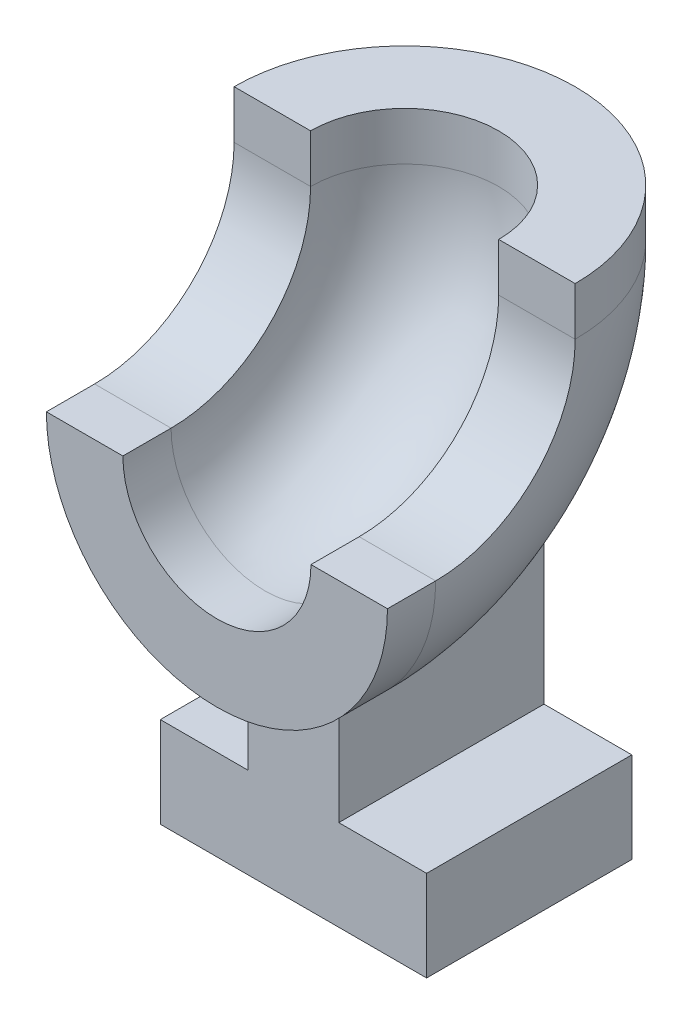
ISO-10303-21;
HEADER;
FILE_DESCRIPTION(('STEP AP214'),'2;1');
FILE_NAME('part.step','',(''),(''),'','','');
FILE_SCHEMA(('AUTOMOTIVE_DESIGN { 1 0 10303 214 1 1 1 1 }'));
ENDSEC;
DATA;
#1=APPLICATION_CONTEXT('core data for automotive mechanical design processes');
#2=APPLICATION_PROTOCOL_DEFINITION('international standard','automotive_design',2000,#1);
#3=PRODUCT_CONTEXT('',#1,'mechanical');
#4=PRODUCT('Part','Part','',(#3));
#5=PRODUCT_RELATED_PRODUCT_CATEGORY('part','',(#4));
#6=PRODUCT_DEFINITION_FORMATION('','',#4);
#7=PRODUCT_DEFINITION_CONTEXT('part definition',#1,'design');
#8=PRODUCT_DEFINITION('design','',#6,#7);
#9=PRODUCT_DEFINITION_SHAPE('','',#8);
#10=(LENGTH_UNIT() NAMED_UNIT(*) SI_UNIT(.MILLI.,.METRE.));
#11=(NAMED_UNIT(*) PLANE_ANGLE_UNIT() SI_UNIT($,.RADIAN.));
#12=(NAMED_UNIT(*) SI_UNIT($,.STERADIAN.) SOLID_ANGLE_UNIT());
#13=UNCERTAINTY_MEASURE_WITH_UNIT(LENGTH_MEASURE(1.E-05),#10,'distance_accuracy_value','');
#14=(GEOMETRIC_REPRESENTATION_CONTEXT(3) GLOBAL_UNCERTAINTY_ASSIGNED_CONTEXT((#13)) GLOBAL_UNIT_ASSIGNED_CONTEXT((#10,
#11,#12)) REPRESENTATION_CONTEXT('',''));
#15=CARTESIAN_POINT('',(0.,0.,0.));
#16=DIRECTION('',(0.,0.,1.));
#17=DIRECTION('',(1.,0.,0.));
#18=AXIS2_PLACEMENT_3D('',#15,#16,#17);
#19=CARTESIAN_POINT('',(11.938,0.,0.));
#20=DIRECTION('',(-1.,0.,0.));
#21=DIRECTION('',(0.,0.,1.));
#22=AXIS2_PLACEMENT_3D('',#19,#20,#21);
#23=PLANE('',#22);
#24=DIRECTION('',(0.,-1.,0.));
#25=VECTOR('',#24,1.);
#26=CARTESIAN_POINT('',(11.938,-33.782,-8.89373853094304));
#27=LINE('',#26,#25);
#28=CARTESIAN_POINT('',(11.938,-25.654,-8.89373853094304));
#29=VERTEX_POINT('',#28);
#30=CARTESIAN_POINT('',(11.938,-33.782,-8.89373853094304));
#31=VERTEX_POINT('',#30);
#32=EDGE_CURVE('E234',#29,#31,#27,.T.);
#33=ORIENTED_EDGE('',*,*,#32,.T.);
#34=DIRECTION('',(0.,0.,-1.));
#35=VECTOR('',#34,1.);
#36=CARTESIAN_POINT('',(11.938,-33.782,-8.89373853094304));
#37=LINE('',#36,#35);
#38=CARTESIAN_POINT('',(11.938,-33.782,-27.2960385309431));
#39=VERTEX_POINT('',#38);
#40=EDGE_CURVE('E331',#31,#39,#37,.T.);
#41=ORIENTED_EDGE('',*,*,#40,.T.);
#42=DIRECTION('',(0.,1.,0.));
#43=VECTOR('',#42,1.);
#44=CARTESIAN_POINT('',(11.938,-33.782,-27.2960385309431));
#45=LINE('',#44,#43);
#46=CARTESIAN_POINT('',(11.938,-25.654,-27.2960385309431));
#47=VERTEX_POINT('',#46);
#48=EDGE_CURVE('E311',#39,#47,#45,.T.);
#49=ORIENTED_EDGE('',*,*,#48,.T.);
#50=DIRECTION('',(0.,0.,1.));
#51=VECTOR('',#50,1.);
#52=CARTESIAN_POINT('',(11.938,-25.654,-8.89373853094304));
#53=LINE('',#52,#51);
#54=EDGE_CURVE('E10',#47,#29,#53,.T.);
#55=ORIENTED_EDGE('',*,*,#54,.T.);
#56=EDGE_LOOP('',(#33,#41,#49,#55));
#57=FACE_BOUND('',#56,.T.);
#58=ADVANCED_FACE('F16',(#57),#23,.F.);
#59=CARTESIAN_POINT('',(11.938,-25.654,-8.89373853094304));
#60=DIRECTION('',(0.,-1.,0.));
#61=DIRECTION('',(0.,0.,-1.));
#62=AXIS2_PLACEMENT_3D('',#59,#60,#61);
#63=PLANE('',#62);
#64=DIRECTION('',(0.,0.,-1.));
#65=VECTOR('',#64,1.);
#66=CARTESIAN_POINT('',(4.064,-25.654,-6.35373853094304));
#67=LINE('',#66,#65);
#68=CARTESIAN_POINT('',(4.064,-25.654,-8.89373853094304));
#69=VERTEX_POINT('',#68);
#70=CARTESIAN_POINT('',(4.064,-25.654,-27.2960385309431));
#71=VERTEX_POINT('',#70);
#72=EDGE_CURVE('E388',#69,#71,#67,.T.);
#73=ORIENTED_EDGE('',*,*,#72,.F.);
#74=DIRECTION('',(-1.,0.,0.));
#75=VECTOR('',#74,1.);
#76=CARTESIAN_POINT('',(11.938,-25.654,-8.89373853094304));
#77=LINE('',#76,#75);
#78=EDGE_CURVE('E230',#29,#69,#77,.T.);
#79=ORIENTED_EDGE('',*,*,#78,.F.);
#80=ORIENTED_EDGE('',*,*,#54,.F.);
#81=DIRECTION('',(-1.,0.,0.));
#82=VECTOR('',#81,1.);
#83=CARTESIAN_POINT('',(11.938,-25.654,-27.2960385309431));
#84=LINE('',#83,#82);
#85=EDGE_CURVE('E314',#47,#71,#84,.T.);
#86=ORIENTED_EDGE('',*,*,#85,.T.);
#87=EDGE_LOOP('',(#73,#79,#80,#86));
#88=FACE_BOUND('',#87,.T.);
#89=ADVANCED_FACE('F367',(#88),#63,.F.);
#90=CARTESIAN_POINT('',(11.938,-25.654,-8.89373853094304));
#91=DIRECTION('',(0.,-1.,0.));
#92=DIRECTION('',(0.,0.,-1.));
#93=AXIS2_PLACEMENT_3D('',#90,#91,#92);
#94=PLANE('',#93);
#95=DIRECTION('',(-1.,0.,0.));
#96=VECTOR('',#95,1.);
#97=CARTESIAN_POINT('',(11.938,-25.654,-8.89373853094304));
#98=LINE('',#97,#96);
#99=CARTESIAN_POINT('',(-4.064,-25.654,-8.89373853094304));
#100=VERTEX_POINT('',#99);
#101=CARTESIAN_POINT('',(-11.938,-25.654,-8.89373853094304));
#102=VERTEX_POINT('',#101);
#103=EDGE_CURVE('E233',#100,#102,#98,.T.);
#104=ORIENTED_EDGE('',*,*,#103,.F.);
#105=DIRECTION('',(0.,0.,-1.));
#106=VECTOR('',#105,1.);
#107=CARTESIAN_POINT('',(-4.064,-25.654,-6.35373853094304));
#108=LINE('',#107,#106);
#109=CARTESIAN_POINT('',(-4.064,-25.654,-27.2960385309431));
#110=VERTEX_POINT('',#109);
#111=EDGE_CURVE('E213',#100,#110,#108,.T.);
#112=ORIENTED_EDGE('',*,*,#111,.T.);
#113=DIRECTION('',(-1.,0.,0.));
#114=VECTOR('',#113,1.);
#115=CARTESIAN_POINT('',(11.938,-25.654,-27.2960385309431));
#116=LINE('',#115,#114);
#117=CARTESIAN_POINT('',(-11.938,-25.654,-27.2960385309431));
#118=VERTEX_POINT('',#117);
#119=EDGE_CURVE('E306',#110,#118,#116,.T.);
#120=ORIENTED_EDGE('',*,*,#119,.T.);
#121=DIRECTION('',(0.,0.,1.));
#122=VECTOR('',#121,1.);
#123=CARTESIAN_POINT('',(-11.938,-25.654,-8.89373853094304));
#124=LINE('',#123,#122);
#125=EDGE_CURVE('E25',#118,#102,#124,.T.);
#126=ORIENTED_EDGE('',*,*,#125,.T.);
#127=EDGE_LOOP('',(#104,#112,#120,#126));
#128=FACE_BOUND('',#127,.T.);
#129=ADVANCED_FACE('F364',(#128),#94,.F.);
#130=CARTESIAN_POINT('',(-11.938,0.,0.));
#131=DIRECTION('',(-1.,0.,0.));
#132=DIRECTION('',(0.,0.,1.));
#133=AXIS2_PLACEMENT_3D('',#130,#131,#132);
#134=PLANE('',#133);
#135=DIRECTION('',(0.,-1.,0.));
#136=VECTOR('',#135,1.);
#137=CARTESIAN_POINT('',(-11.938,-33.782,-8.89373853094304));
#138=LINE('',#137,#136);
#139=CARTESIAN_POINT('',(-11.938,-33.782,-8.89373853094304));
#140=VERTEX_POINT('',#139);
#141=EDGE_CURVE('E324',#102,#140,#138,.T.);
#142=ORIENTED_EDGE('',*,*,#141,.F.);
#143=ORIENTED_EDGE('',*,*,#125,.F.);
#144=DIRECTION('',(0.,1.,0.));
#145=VECTOR('',#144,1.);
#146=CARTESIAN_POINT('',(-11.938,-33.782,-27.2960385309431));
#147=LINE('',#146,#145);
#148=CARTESIAN_POINT('',(-11.938,-33.782,-27.2960385309431));
#149=VERTEX_POINT('',#148);
#150=EDGE_CURVE('E241',#149,#118,#147,.T.);
#151=ORIENTED_EDGE('',*,*,#150,.F.);
#152=DIRECTION('',(0.,0.,-1.));
#153=VECTOR('',#152,1.);
#154=CARTESIAN_POINT('',(-11.938,-33.782,-8.89373853094304));
#155=LINE('',#154,#153);
#156=EDGE_CURVE('E328',#140,#149,#155,.T.);
#157=ORIENTED_EDGE('',*,*,#156,.F.);
#158=EDGE_LOOP('',(#142,#143,#151,#157));
#159=FACE_BOUND('',#158,.T.);
#160=ADVANCED_FACE('F361',(#159),#134,.T.);
#161=CARTESIAN_POINT('',(4.064,-33.782,-8.89373853094304));
#162=DIRECTION('',(0.,1.,0.));
#163=DIRECTION('',(1.,0.,0.));
#164=AXIS2_PLACEMENT_3D('',#161,#162,#163);
#165=PLANE('',#164);
#166=DIRECTION('',(-1.,0.,0.));
#167=VECTOR('',#166,1.);
#168=CARTESIAN_POINT('',(4.064,-33.782,-8.89373853094304));
#169=LINE('',#168,#167);
#170=EDGE_CURVE('E307',#31,#140,#169,.T.);
#171=ORIENTED_EDGE('',*,*,#170,.T.);
#172=ORIENTED_EDGE('',*,*,#156,.T.);
#173=DIRECTION('',(-1.,0.,0.));
#174=VECTOR('',#173,1.);
#175=CARTESIAN_POINT('',(4.064,-33.782,-27.2960385309431));
#176=LINE('',#175,#174);
#177=EDGE_CURVE('E237',#39,#149,#176,.T.);
#178=ORIENTED_EDGE('',*,*,#177,.F.);
#179=ORIENTED_EDGE('',*,*,#40,.F.);
#180=EDGE_LOOP('',(#171,#172,#178,#179));
#181=FACE_BOUND('',#180,.T.);
#182=ADVANCED_FACE('F358',(#181),#165,.F.);
#183=CARTESIAN_POINT('',(4.064,-8.27819658451845,-8.89373853094304));
#184=DIRECTION('',(0.,0.,-1.));
#185=DIRECTION('',(0.,-1.,0.));
#186=AXIS2_PLACEMENT_3D('',#183,#184,#185);
#187=PLANE('',#186);
#188=ORIENTED_EDGE('',*,*,#170,.F.);
#189=ORIENTED_EDGE('',*,*,#32,.F.);
#190=ORIENTED_EDGE('',*,*,#78,.T.);
#191=DIRECTION('',(0.,-1.,0.));
#192=VECTOR('',#191,1.);
#193=CARTESIAN_POINT('',(4.064,-8.27819658451845,-8.89373853094304));
#194=LINE('',#193,#192);
#195=CARTESIAN_POINT('',(4.064,-14.6222088243739,-8.89373853094304));
#196=VERTEX_POINT('',#195);
#197=EDGE_CURVE('E391',#196,#69,#194,.T.);
#198=ORIENTED_EDGE('',*,*,#197,.F.);
#199=CARTESIAN_POINT('',(4.064,-14.6222088243739,-8.89373853094304));
#200=CARTESIAN_POINT('',(2.07130996899468,-15.1739888115514,-8.89373853094304));
#201=CARTESIAN_POINT('',(0.00337201133414951,-15.1745217348797,-8.89373853094304));
#202=CARTESIAN_POINT('',(-2.06745809457848,-15.1750554035366,-8.89373853094304));
#203=CARTESIAN_POINT('',(-4.064,-14.6222088243739,-8.89373853094304));
#204=B_SPLINE_CURVE_WITH_KNOTS('',2,(#199,#200,#201,#202,#203),.UNSPECIFIED.,.F.,.F.,(3,2,3),
(0.,0.5,1.),.UNSPECIFIED.);
#205=CARTESIAN_POINT('',(-4.064,-14.6222088243739,-8.89373853094304));
#206=VERTEX_POINT('',#205);
#207=EDGE_CURVE('E285',#196,#206,#204,.T.);
#208=ORIENTED_EDGE('',*,*,#207,.T.);
#209=DIRECTION('',(0.,-1.,0.));
#210=VECTOR('',#209,1.);
#211=CARTESIAN_POINT('',(-4.064,-8.27819658451845,-8.89373853094304));
#212=LINE('',#211,#210);
#213=EDGE_CURVE('E409',#206,#100,#212,.T.);
#214=ORIENTED_EDGE('',*,*,#213,.T.);
#215=ORIENTED_EDGE('',*,*,#103,.T.);
#216=ORIENTED_EDGE('',*,*,#141,.T.);
#217=EDGE_LOOP('',(#188,#189,#190,#198,#208,#214,#215,#216));
#218=FACE_BOUND('',#217,.T.);
#219=ADVANCED_FACE('F356',(#218),#187,.F.);
#220=CARTESIAN_POINT('',(4.064,12.5095,-27.2960385309431));
#221=DIRECTION('',(0.,0.,1.));
#222=DIRECTION('',(1.,0.,0.));
#223=AXIS2_PLACEMENT_3D('',#220,#221,#222);
#224=PLANE('',#223);
#225=ORIENTED_EDGE('',*,*,#177,.T.);
#226=ORIENTED_EDGE('',*,*,#150,.T.);
#227=ORIENTED_EDGE('',*,*,#119,.F.);
#228=DIRECTION('',(0.,1.,0.));
#229=VECTOR('',#228,1.);
#230=CARTESIAN_POINT('',(-4.064,12.5095,-27.2960385309431));
#231=LINE('',#230,#229);
#232=CARTESIAN_POINT('',(-4.064,-4.92613289475343,-27.2960385309431));
#233=VERTEX_POINT('',#232);
#234=EDGE_CURVE('E200',#110,#233,#231,.T.);
#235=ORIENTED_EDGE('',*,*,#234,.T.);
#236=CARTESIAN_POINT('',(-4.064,-4.92613289475345,-27.2960385309431));
#237=CARTESIAN_POINT('',(-3.09065037004677,-5.34553875640835,-27.2960385309431));
#238=CARTESIAN_POINT('',(-2.06915462114008,-5.5591614245063,-27.2960385309431));
#239=CARTESIAN_POINT('',(-1.04007221308786,-5.7743706702972,-27.2960385309431));
#240=CARTESIAN_POINT('',(0.0066588423128797,-5.77373467510155,-27.2960385309431));
#241=CARTESIAN_POINT('',(1.04884868436616,-5.77310143915325,-27.2960385309431));
#242=CARTESIAN_POINT('',(2.07550506722882,-5.5578316180273,-27.2960385309431));
#243=CARTESIAN_POINT('',(3.09319688138306,-5.34444149212805,-27.2960385309431));
#244=CARTESIAN_POINT('',(4.06400000000009,-4.9261328947534,-27.2960385309431));
#245=B_SPLINE_CURVE_WITH_KNOTS('',2,(#236,#237,#238,#239,#240,#241,#242,#243,#244),
.UNSPECIFIED.,.F.,.F.,(3,2,2,2,3),(0.,0.25,0.5,0.75,1.),.UNSPECIFIED.);
#246=CARTESIAN_POINT('',(4.06400000000009,-4.92613289475339,-27.2960385309431));
#247=VERTEX_POINT('',#246);
#248=EDGE_CURVE('E289',#233,#247,#245,.T.);
#249=ORIENTED_EDGE('',*,*,#248,.T.);
#250=DIRECTION('',(0.,1.,0.));
#251=VECTOR('',#250,1.);
#252=CARTESIAN_POINT('',(4.064,12.5095,-27.2960385309431));
#253=LINE('',#252,#251);
#254=EDGE_CURVE('E385',#71,#247,#253,.T.);
#255=ORIENTED_EDGE('',*,*,#254,.F.);
#256=ORIENTED_EDGE('',*,*,#85,.F.);
#257=ORIENTED_EDGE('',*,*,#48,.F.);
#258=EDGE_LOOP('',(#225,#226,#227,#235,#249,#255,#256,#257));
#259=FACE_BOUND('',#258,.T.);
#260=ADVANCED_FACE('F345',(#259),#224,.F.);
#261=CARTESIAN_POINT('',(0.,0.,-2.032));
#262=DIRECTION('',(0.,0.,1.));
#263=DIRECTION('',(1.,0.,0.));
#264=AXIS2_PLACEMENT_3D('',#261,#262,#263);
#265=PLANE('',#264);
#266=CARTESIAN_POINT('',(0.,0.,-2.032));
#267=DIRECTION('',(0.,0.,1.));
#268=DIRECTION('',(1.,0.,0.));
#269=AXIS2_PLACEMENT_3D('',#266,#267,#268);
#270=CIRCLE('',#269,15.2908);
#271=CARTESIAN_POINT('',(-15.2908,0.,-2.032));
#272=VERTEX_POINT('',#271);
#273=CARTESIAN_POINT('',(15.2908,0.,-2.032));
#274=VERTEX_POINT('',#273);
#275=EDGE_CURVE('E242',#272,#274,#270,.T.);
#276=ORIENTED_EDGE('',*,*,#275,.T.);
#277=DIRECTION('',(-1.,0.,0.));
#278=VECTOR('',#277,1.);
#279=CARTESIAN_POINT('',(8.4328,0.,-2.032));
#280=LINE('',#279,#278);
#281=CARTESIAN_POINT('',(8.4328,0.,-2.032));
#282=VERTEX_POINT('',#281);
#283=EDGE_CURVE('E295',#274,#282,#280,.T.);
#284=ORIENTED_EDGE('',*,*,#283,.T.);
#285=CARTESIAN_POINT('',(0.,0.,-2.032));
#286=DIRECTION('',(0.,0.,-1.));
#287=DIRECTION('',(1.,0.,0.));
#288=AXIS2_PLACEMENT_3D('',#285,#286,#287);
#289=CIRCLE('',#288,8.4328);
#290=CARTESIAN_POINT('',(-8.4328,0.,-2.032));
#291=VERTEX_POINT('',#290);
#292=EDGE_CURVE('E220',#282,#291,#289,.T.);
#293=ORIENTED_EDGE('',*,*,#292,.T.);
#294=DIRECTION('',(-1.,0.,0.));
#295=VECTOR('',#294,1.);
#296=CARTESIAN_POINT('',(-15.2908,0.,-2.032));
#297=LINE('',#296,#295);
#298=EDGE_CURVE('E248',#291,#272,#297,.T.);
#299=ORIENTED_EDGE('',*,*,#298,.T.);
#300=EDGE_LOOP('',(#276,#284,#293,#299));
#301=FACE_BOUND('',#300,.T.);
#302=ADVANCED_FACE('F355',(#301),#265,.T.);
#303=CARTESIAN_POINT('',(0.,16.8312385309532,-18.8632385309431));
#304=DIRECTION('',(0.,-1.,0.));
#305=DIRECTION('',(0.,0.,-1.));
#306=AXIS2_PLACEMENT_3D('',#303,#304,#305);
#307=PLANE('',#306);
#308=CARTESIAN_POINT('',(0.,16.8312385309532,-18.8632385309431));
#309=DIRECTION('',(0.,-1.,0.));
#310=DIRECTION('',(1.,0.,0.));
#311=AXIS2_PLACEMENT_3D('',#308,#309,#310);
#312=CIRCLE('',#311,15.2908);
#313=CARTESIAN_POINT('',(-15.2908,16.8312385309532,-18.8632385309431));
#314=VERTEX_POINT('',#313);
#315=CARTESIAN_POINT('',(15.2908,16.8312385309532,-18.8632385309431));
#316=VERTEX_POINT('',#315);
#317=EDGE_CURVE('E196',#314,#316,#312,.T.);
#318=ORIENTED_EDGE('',*,*,#317,.F.);
#319=DIRECTION('',(-1.,0.,0.));
#320=VECTOR('',#319,1.);
#321=CARTESIAN_POINT('',(-15.2908,16.8312385309532,-18.8632385309431));
#322=LINE('',#321,#320);
#323=CARTESIAN_POINT('',(-8.4328,16.8312385309532,-18.8632385309431));
#324=VERTEX_POINT('',#323);
#325=EDGE_CURVE('E189',#324,#314,#322,.T.);
#326=ORIENTED_EDGE('',*,*,#325,.F.);
#327=CARTESIAN_POINT('',(0.,16.8312385309532,-18.8632385309431));
#328=DIRECTION('',(0.,1.,0.));
#329=DIRECTION('',(1.,0.,0.));
#330=AXIS2_PLACEMENT_3D('',#327,#328,#329);
#331=CIRCLE('',#330,8.4328);
#332=CARTESIAN_POINT('',(8.4328,16.8312385309532,-18.8632385309431));
#333=VERTEX_POINT('',#332);
#334=EDGE_CURVE('E171',#333,#324,#331,.T.);
#335=ORIENTED_EDGE('',*,*,#334,.F.);
#336=DIRECTION('',(-1.,0.,0.));
#337=VECTOR('',#336,1.);
#338=CARTESIAN_POINT('',(8.4328,16.8312385309532,-18.8632385309431));
#339=LINE('',#338,#337);
#340=EDGE_CURVE('E228',#316,#333,#339,.T.);
#341=ORIENTED_EDGE('',*,*,#340,.F.);
#342=EDGE_LOOP('',(#318,#326,#335,#341));
#343=FACE_BOUND('',#342,.T.);
#344=ADVANCED_FACE('F195',(#343),#307,.F.);
#345=CARTESIAN_POINT('',(0.,0.,-2.032));
#346=DIRECTION('',(0.,0.,-1.));
#347=DIRECTION('',(-1.,0.,0.));
#348=AXIS2_PLACEMENT_3D('',#345,#346,#347);
#349=CYLINDRICAL_SURFACE('',#348,15.2908);
#350=DIRECTION('',(0.,0.,-1.));
#351=VECTOR('',#350,1.);
#352=CARTESIAN_POINT('',(15.2908,0.,-2.032));
#353=LINE('',#352,#351);
#354=CARTESIAN_POINT('',(15.2908,0.,-6.35373853094303));
#355=VERTEX_POINT('',#354);
#356=EDGE_CURVE('E298',#274,#355,#353,.T.);
#357=ORIENTED_EDGE('',*,*,#356,.F.);
#358=ORIENTED_EDGE('',*,*,#275,.F.);
#359=DIRECTION('',(0.,0.,-1.));
#360=VECTOR('',#359,1.);
#361=CARTESIAN_POINT('',(-15.2908,0.,-2.032));
#362=LINE('',#361,#360);
#363=CARTESIAN_POINT('',(-15.2908,0.,-6.35373853094303));
#364=VERTEX_POINT('',#363);
#365=EDGE_CURVE('E286',#272,#364,#362,.T.);
#366=ORIENTED_EDGE('',*,*,#365,.T.);
#367=CARTESIAN_POINT('',(0.,0.,-6.35373853094303));
#368=DIRECTION('',(0.,0.,1.));
#369=DIRECTION('',(1.,0.,0.));
#370=AXIS2_PLACEMENT_3D('',#367,#368,#369);
#371=CIRCLE('',#370,15.2908);
#372=EDGE_CURVE('E281',#364,#355,#371,.T.);
#373=ORIENTED_EDGE('',*,*,#372,.T.);
#374=EDGE_LOOP('',(#357,#358,#366,#373));
#375=FACE_BOUND('',#374,.T.);
#376=ADVANCED_FACE('F454',(#375),#349,.T.);
#377=CARTESIAN_POINT('',(8.4328,0.,-2.032));
#378=DIRECTION('',(0.,-1.,0.));
#379=DIRECTION('',(0.,0.,-1.));
#380=AXIS2_PLACEMENT_3D('',#377,#378,#379);
#381=PLANE('',#380);
#382=DIRECTION('',(0.,0.,-1.));
#383=VECTOR('',#382,1.);
#384=CARTESIAN_POINT('',(8.4328,0.,-2.032));
#385=LINE('',#384,#383);
#386=CARTESIAN_POINT('',(8.4328,0.,-6.35373853094303));
#387=VERTEX_POINT('',#386);
#388=EDGE_CURVE('E222',#282,#387,#385,.T.);
#389=ORIENTED_EDGE('',*,*,#388,.F.);
#390=ORIENTED_EDGE('',*,*,#283,.F.);
#391=ORIENTED_EDGE('',*,*,#356,.T.);
#392=DIRECTION('',(-1.,0.,0.));
#393=VECTOR('',#392,1.);
#394=CARTESIAN_POINT('',(8.4328,0.,-6.35373853094303));
#395=LINE('',#394,#393);
#396=EDGE_CURVE('E274',#355,#387,#395,.T.);
#397=ORIENTED_EDGE('',*,*,#396,.T.);
#398=EDGE_LOOP('',(#389,#390,#391,#397));
#399=FACE_BOUND('',#398,.T.);
#400=ADVANCED_FACE('F452',(#399),#381,.F.);
#401=CARTESIAN_POINT('',(0.,0.,-2.032));
#402=DIRECTION('',(0.,0.,-1.));
#403=DIRECTION('',(-1.,0.,0.));
#404=AXIS2_PLACEMENT_3D('',#401,#402,#403);
#405=CYLINDRICAL_SURFACE('',#404,8.4328);
#406=DIRECTION('',(0.,0.,-1.));
#407=VECTOR('',#406,1.);
#408=CARTESIAN_POINT('',(-8.4328,0.,-2.032));
#409=LINE('',#408,#407);
#410=CARTESIAN_POINT('',(-8.4328,0.,-6.35373853094303));
#411=VERTEX_POINT('',#410);
#412=EDGE_CURVE('E223',#291,#411,#409,.T.);
#413=ORIENTED_EDGE('',*,*,#412,.F.);
#414=ORIENTED_EDGE('',*,*,#292,.F.);
#415=ORIENTED_EDGE('',*,*,#388,.T.);
#416=CARTESIAN_POINT('',(0.,0.,-6.35373853094303));
#417=DIRECTION('',(0.,0.,-1.));
#418=DIRECTION('',(1.,0.,0.));
#419=AXIS2_PLACEMENT_3D('',#416,#417,#418);
#420=CIRCLE('',#419,8.4328);
#421=EDGE_CURVE('E267',#387,#411,#420,.T.);
#422=ORIENTED_EDGE('',*,*,#421,.T.);
#423=EDGE_LOOP('',(#413,#414,#415,#422));
#424=FACE_BOUND('',#423,.T.);
#425=ADVANCED_FACE('F449',(#424),#405,.F.);
#426=CARTESIAN_POINT('',(-15.2908,0.,-2.032));
#427=DIRECTION('',(0.,-1.,0.));
#428=DIRECTION('',(0.,0.,-1.));
#429=AXIS2_PLACEMENT_3D('',#426,#427,#428);
#430=PLANE('',#429);
#431=DIRECTION('',(-1.,0.,0.));
#432=VECTOR('',#431,1.);
#433=CARTESIAN_POINT('',(-15.2908,0.,-6.35373853094303));
#434=LINE('',#433,#432);
#435=EDGE_CURVE('E259',#411,#364,#434,.T.);
#436=ORIENTED_EDGE('',*,*,#435,.T.);
#437=ORIENTED_EDGE('',*,*,#365,.F.);
#438=ORIENTED_EDGE('',*,*,#298,.F.);
#439=ORIENTED_EDGE('',*,*,#412,.T.);
#440=EDGE_LOOP('',(#436,#437,#438,#439));
#441=FACE_BOUND('',#440,.T.);
#442=ADVANCED_FACE('F460',(#441),#430,.F.);
#443=CARTESIAN_POINT('',(0.,12.5095,-6.35373853094304));
#444=DIRECTION('',(1.,0.,0.));
#445=DIRECTION('',(0.,0.,-1.));
#446=AXIS2_PLACEMENT_3D('',#443,#444,#445);
#447=DEGENERATE_TOROIDAL_SURFACE('',#446,12.5095,15.2908,.T.);
#448=ORIENTED_EDGE('',*,*,#207,.F.);
#449=CARTESIAN_POINT('',(4.064,12.5095,-6.35373853094304));
#450=DIRECTION('',(1.,0.,0.));
#451=DIRECTION('',(0.,0.,-1.));
#452=AXIS2_PLACEMENT_3D('',#449,#450,#451);
#453=CIRCLE('',#452,27.2503435525244);
#454=EDGE_CURVE('E420',#196,#247,#453,.T.);
#455=ORIENTED_EDGE('',*,*,#454,.T.);
#456=ORIENTED_EDGE('',*,*,#248,.F.);
#457=CARTESIAN_POINT('',(-4.064,12.5095,-6.35373853094304));
#458=DIRECTION('',(1.,0.,0.));
#459=DIRECTION('',(0.,0.,-1.));
#460=AXIS2_PLACEMENT_3D('',#457,#458,#459);
#461=CIRCLE('',#460,27.2503435525244);
#462=EDGE_CURVE('E209',#206,#233,#461,.T.);
#463=ORIENTED_EDGE('',*,*,#462,.F.);
#464=EDGE_LOOP('',(#448,#455,#456,#463));
#465=FACE_BOUND('',#464,.T.);
#466=CARTESIAN_POINT('',(15.2908,12.5095,-6.35373853094304));
#467=DIRECTION('',(1.,0.,0.));
#468=DIRECTION('',(0.,-1.,0.));
#469=AXIS2_PLACEMENT_3D('',#466,#467,#468);
#470=CIRCLE('',#469,12.5095);
#471=CARTESIAN_POINT('',(15.2908,12.5095,-18.8632385309431));
#472=VERTEX_POINT('',#471);
#473=EDGE_CURVE('E278',#355,#472,#470,.T.);
#474=ORIENTED_EDGE('',*,*,#473,.F.);
#475=ORIENTED_EDGE('',*,*,#372,.F.);
#476=CARTESIAN_POINT('',(-15.2908,12.5095,-6.35373853094304));
#477=DIRECTION('',(1.,0.,0.));
#478=DIRECTION('',(0.,-1.,0.));
#479=AXIS2_PLACEMENT_3D('',#476,#477,#478);
#480=CIRCLE('',#479,12.5095);
#481=CARTESIAN_POINT('',(-15.2908,12.5095,-18.8632385309431));
#482=VERTEX_POINT('',#481);
#483=EDGE_CURVE('E257',#364,#482,#480,.T.);
#484=ORIENTED_EDGE('',*,*,#483,.T.);
#485=CARTESIAN_POINT('',(0.,12.5095,-18.8632385309431));
#486=DIRECTION('',(0.,-1.,0.));
#487=DIRECTION('',(1.,0.,0.));
#488=AXIS2_PLACEMENT_3D('',#485,#486,#487);
#489=CIRCLE('',#488,15.2908);
#490=EDGE_CURVE('E251',#482,#472,#489,.T.);
#491=ORIENTED_EDGE('',*,*,#490,.T.);
#492=EDGE_LOOP('',(#474,#475,#484,#491));
#493=FACE_BOUND('',#492,.T.);
#494=ADVANCED_FACE('F476',(#465,#493),#447,.T.);
#495=CARTESIAN_POINT('',(0.,12.5095,-6.35373853094304));
#496=DIRECTION('',(1.,0.,0.));
#497=DIRECTION('',(0.,0.,-1.));
#498=AXIS2_PLACEMENT_3D('',#495,#496,#497);
#499=CYLINDRICAL_SURFACE('',#498,12.5095);
#500=CARTESIAN_POINT('',(8.4328,12.5095,-6.35373853094304));
#501=DIRECTION('',(1.,0.,0.));
#502=DIRECTION('',(0.,-1.,0.));
#503=AXIS2_PLACEMENT_3D('',#500,#501,#502);
#504=CIRCLE('',#503,12.5095);
#505=CARTESIAN_POINT('',(8.4328,12.5095,-18.8632385309431));
#506=VERTEX_POINT('',#505);
#507=EDGE_CURVE('E271',#387,#506,#504,.T.);
#508=ORIENTED_EDGE('',*,*,#507,.F.);
#509=ORIENTED_EDGE('',*,*,#396,.F.);
#510=ORIENTED_EDGE('',*,*,#473,.T.);
#511=DIRECTION('',(-1.,0.,0.));
#512=VECTOR('',#511,1.);
#513=CARTESIAN_POINT('',(8.4328,12.5095,-18.8632385309431));
#514=LINE('',#513,#512);
#515=EDGE_CURVE('E183',#472,#506,#514,.T.);
#516=ORIENTED_EDGE('',*,*,#515,.T.);
#517=EDGE_LOOP('',(#508,#509,#510,#516));
#518=FACE_BOUND('',#517,.T.);
#519=ADVANCED_FACE('F480',(#518),#499,.F.);
#520=CARTESIAN_POINT('',(0.,12.5095,-6.35373853094304));
#521=DIRECTION('',(1.,0.,0.));
#522=DIRECTION('',(0.,0.,-1.));
#523=AXIS2_PLACEMENT_3D('',#520,#521,#522);
#524=TOROIDAL_SURFACE('',#523,12.5095,8.4328);
#525=CARTESIAN_POINT('',(0.,12.5095,-18.8632385309431));
#526=DIRECTION('',(0.,1.,0.));
#527=DIRECTION('',(1.,0.,0.));
#528=AXIS2_PLACEMENT_3D('',#525,#526,#527);
#529=CIRCLE('',#528,8.4328);
#530=CARTESIAN_POINT('',(-8.4328,12.5095,-18.8632385309431));
#531=VERTEX_POINT('',#530);
#532=EDGE_CURVE('E193',#506,#531,#529,.T.);
#533=ORIENTED_EDGE('',*,*,#532,.T.);
#534=CARTESIAN_POINT('',(-8.4328,12.5095,-6.35373853094304));
#535=DIRECTION('',(1.,0.,0.));
#536=DIRECTION('',(0.,-1.,0.));
#537=AXIS2_PLACEMENT_3D('',#534,#535,#536);
#538=CIRCLE('',#537,12.5095);
#539=EDGE_CURVE('E264',#411,#531,#538,.T.);
#540=ORIENTED_EDGE('',*,*,#539,.F.);
#541=ORIENTED_EDGE('',*,*,#421,.F.);
#542=ORIENTED_EDGE('',*,*,#507,.T.);
#543=EDGE_LOOP('',(#533,#540,#541,#542));
#544=FACE_BOUND('',#543,.T.);
#545=ADVANCED_FACE('F485',(#544),#524,.F.);
#546=CARTESIAN_POINT('',(0.,12.5095,-6.35373853094304));
#547=DIRECTION('',(1.,0.,0.));
#548=DIRECTION('',(0.,0.,-1.));
#549=AXIS2_PLACEMENT_3D('',#546,#547,#548);
#550=CYLINDRICAL_SURFACE('',#549,12.5095);
#551=DIRECTION('',(-1.,0.,0.));
#552=VECTOR('',#551,1.);
#553=CARTESIAN_POINT('',(-15.2908,12.5095,-18.8632385309431));
#554=LINE('',#553,#552);
#555=EDGE_CURVE('E191',#531,#482,#554,.T.);
#556=ORIENTED_EDGE('',*,*,#555,.T.);
#557=ORIENTED_EDGE('',*,*,#483,.F.);
#558=ORIENTED_EDGE('',*,*,#435,.F.);
#559=ORIENTED_EDGE('',*,*,#539,.T.);
#560=EDGE_LOOP('',(#556,#557,#558,#559));
#561=FACE_BOUND('',#560,.T.);
#562=ADVANCED_FACE('F489',(#561),#550,.F.);
#563=CARTESIAN_POINT('',(0.,12.5095,-18.8632385309431));
#564=DIRECTION('',(0.,1.,0.));
#565=DIRECTION('',(0.,0.,1.));
#566=AXIS2_PLACEMENT_3D('',#563,#564,#565);
#567=CYLINDRICAL_SURFACE('',#566,15.2908);
#568=DIRECTION('',(0.,1.,0.));
#569=VECTOR('',#568,1.);
#570=CARTESIAN_POINT('',(15.2908,12.5095,-18.8632385309431));
#571=LINE('',#570,#569);
#572=EDGE_CURVE('E225',#472,#316,#571,.T.);
#573=ORIENTED_EDGE('',*,*,#572,.F.);
#574=ORIENTED_EDGE('',*,*,#490,.F.);
#575=DIRECTION('',(0.,1.,0.));
#576=VECTOR('',#575,1.);
#577=CARTESIAN_POINT('',(-15.2908,12.5095,-18.8632385309431));
#578=LINE('',#577,#576);
#579=EDGE_CURVE('E199',#482,#314,#578,.T.);
#580=ORIENTED_EDGE('',*,*,#579,.T.);
#581=ORIENTED_EDGE('',*,*,#317,.T.);
#582=EDGE_LOOP('',(#573,#574,#580,#581));
#583=FACE_BOUND('',#582,.T.);
#584=ADVANCED_FACE('F512',(#583),#567,.T.);
#585=CARTESIAN_POINT('',(8.4328,12.5095,-18.8632385309431));
#586=DIRECTION('',(0.,0.,-1.));
#587=DIRECTION('',(0.,-1.,0.));
#588=AXIS2_PLACEMENT_3D('',#585,#586,#587);
#589=PLANE('',#588);
#590=DIRECTION('',(0.,1.,0.));
#591=VECTOR('',#590,1.);
#592=CARTESIAN_POINT('',(8.4328,12.5095,-18.8632385309431));
#593=LINE('',#592,#591);
#594=EDGE_CURVE('E178',#506,#333,#593,.T.);
#595=ORIENTED_EDGE('',*,*,#594,.F.);
#596=ORIENTED_EDGE('',*,*,#515,.F.);
#597=ORIENTED_EDGE('',*,*,#572,.T.);
#598=ORIENTED_EDGE('',*,*,#340,.T.);
#599=EDGE_LOOP('',(#595,#596,#597,#598));
#600=FACE_BOUND('',#599,.T.);
#601=ADVANCED_FACE('F515',(#600),#589,.F.);
#602=CARTESIAN_POINT('',(0.,12.5095,-18.8632385309431));
#603=DIRECTION('',(0.,1.,0.));
#604=DIRECTION('',(0.,0.,1.));
#605=AXIS2_PLACEMENT_3D('',#602,#603,#604);
#606=CYLINDRICAL_SURFACE('',#605,8.4328);
#607=DIRECTION('',(0.,1.,0.));
#608=VECTOR('',#607,1.);
#609=CARTESIAN_POINT('',(-8.4328,12.5095,-18.8632385309431));
#610=LINE('',#609,#608);
#611=EDGE_CURVE('E175',#531,#324,#610,.T.);
#612=ORIENTED_EDGE('',*,*,#611,.F.);
#613=ORIENTED_EDGE('',*,*,#532,.F.);
#614=ORIENTED_EDGE('',*,*,#594,.T.);
#615=ORIENTED_EDGE('',*,*,#334,.T.);
#616=EDGE_LOOP('',(#612,#613,#614,#615));
#617=FACE_BOUND('',#616,.T.);
#618=ADVANCED_FACE('F173',(#617),#606,.F.);
#619=CARTESIAN_POINT('',(-15.2908,12.5095,-18.8632385309431));
#620=DIRECTION('',(0.,0.,-1.));
#621=DIRECTION('',(0.,-1.,0.));
#622=AXIS2_PLACEMENT_3D('',#619,#620,#621);
#623=PLANE('',#622);
#624=ORIENTED_EDGE('',*,*,#325,.T.);
#625=ORIENTED_EDGE('',*,*,#579,.F.);
#626=ORIENTED_EDGE('',*,*,#555,.F.);
#627=ORIENTED_EDGE('',*,*,#611,.T.);
#628=EDGE_LOOP('',(#624,#625,#626,#627));
#629=FACE_BOUND('',#628,.T.);
#630=ADVANCED_FACE('F187',(#629),#623,.F.);
#631=CARTESIAN_POINT('',(-4.064,12.5095,-6.35373853094304));
#632=DIRECTION('',(1.,0.,0.));
#633=DIRECTION('',(0.,1.,0.));
#634=AXIS2_PLACEMENT_3D('',#631,#632,#633);
#635=PLANE('',#634);
#636=ORIENTED_EDGE('',*,*,#111,.F.);
#637=ORIENTED_EDGE('',*,*,#213,.F.);
#638=ORIENTED_EDGE('',*,*,#462,.T.);
#639=ORIENTED_EDGE('',*,*,#234,.F.);
#640=EDGE_LOOP('',(#636,#637,#638,#639));
#641=FACE_BOUND('',#640,.T.);
#642=ADVANCED_FACE('F520',(#641),#635,.F.);
#643=CARTESIAN_POINT('',(4.064,12.5095,-6.35373853094304));
#644=DIRECTION('',(1.,0.,0.));
#645=DIRECTION('',(0.,1.,0.));
#646=AXIS2_PLACEMENT_3D('',#643,#644,#645);
#647=PLANE('',#646);
#648=ORIENTED_EDGE('',*,*,#197,.T.);
#649=ORIENTED_EDGE('',*,*,#72,.T.);
#650=ORIENTED_EDGE('',*,*,#254,.T.);
#651=ORIENTED_EDGE('',*,*,#454,.F.);
#652=EDGE_LOOP('',(#648,#649,#650,#651));
#653=FACE_BOUND('',#652,.T.);
#654=ADVANCED_FACE('F527',(#653),#647,.T.);
#655=CLOSED_SHELL('',(#58,#89,#129,#160,#182,#219,#260,#302,#344,#376,#400,#425,#442,#494,#519,
#545,#562,#584,#601,#618,#630,#642,#654));
#656=MANIFOLD_SOLID_BREP('B1',#655);
#657=ADVANCED_BREP_SHAPE_REPRESENTATION('',(#18,#656),#14);
#658=SHAPE_DEFINITION_REPRESENTATION(#9,#657);
ENDSEC;
END-ISO-10303-21;
